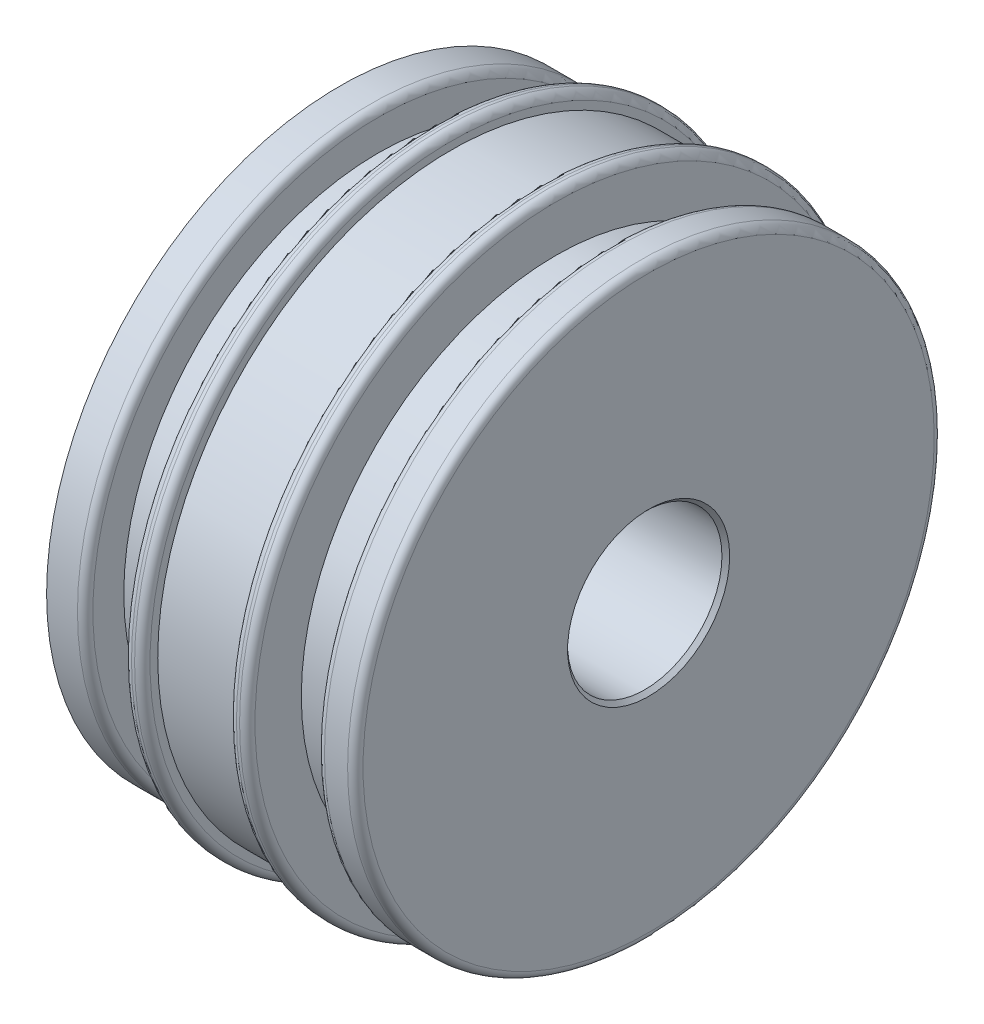
ISO-10303-21;
HEADER;
FILE_DESCRIPTION(('STEP AP214'),'2;1');
FILE_NAME('part.step','',(''),(''),'','','');
FILE_SCHEMA(('AUTOMOTIVE_DESIGN { 1 0 10303 214 1 1 1 1 }'));
ENDSEC;
DATA;
#1=APPLICATION_CONTEXT('core data for automotive mechanical design processes');
#2=APPLICATION_PROTOCOL_DEFINITION('international standard','automotive_design',2000,#1);
#3=PRODUCT_CONTEXT('',#1,'mechanical');
#4=PRODUCT('Part','Part','',(#3));
#5=PRODUCT_RELATED_PRODUCT_CATEGORY('part','',(#4));
#6=PRODUCT_DEFINITION_FORMATION('','',#4);
#7=PRODUCT_DEFINITION_CONTEXT('part definition',#1,'design');
#8=PRODUCT_DEFINITION('design','',#6,#7);
#9=PRODUCT_DEFINITION_SHAPE('','',#8);
#10=(LENGTH_UNIT() NAMED_UNIT(*) SI_UNIT(.MILLI.,.METRE.));
#11=(NAMED_UNIT(*) PLANE_ANGLE_UNIT() SI_UNIT($,.RADIAN.));
#12=(NAMED_UNIT(*) SI_UNIT($,.STERADIAN.) SOLID_ANGLE_UNIT());
#13=UNCERTAINTY_MEASURE_WITH_UNIT(LENGTH_MEASURE(1.E-05),#10,'distance_accuracy_value','');
#14=(GEOMETRIC_REPRESENTATION_CONTEXT(3) GLOBAL_UNCERTAINTY_ASSIGNED_CONTEXT((#13)) GLOBAL_UNIT_ASSIGNED_CONTEXT((#10,
#11,#12)) REPRESENTATION_CONTEXT('',''));
#15=CARTESIAN_POINT('',(0.,0.,0.));
#16=DIRECTION('',(0.,0.,1.));
#17=DIRECTION('',(1.,0.,0.));
#18=AXIS2_PLACEMENT_3D('',#15,#16,#17);
#19=CARTESIAN_POINT('',(-86.0525866178446,5.99999999999999,0.));
#20=DIRECTION('',(-1.,0.,0.));
#21=DIRECTION('',(0.,0.,1.));
#22=AXIS2_PLACEMENT_3D('',#19,#20,#21);
#23=PLANE('',#22);
#24=CARTESIAN_POINT('',(-86.0525866178446,0.,0.));
#25=DIRECTION('',(1.,0.,0.));
#26=DIRECTION('',(0.,0.,-1.));
#27=AXIS2_PLACEMENT_3D('',#24,#25,#26);
#28=CIRCLE('',#27,5.99999999999999);
#29=CARTESIAN_POINT('',(-86.0525866178446,0.,-5.99999999999999));
#30=VERTEX_POINT('',#29);
#31=EDGE_CURVE('E149',#30,#30,#28,.T.);
#32=ORIENTED_EDGE('',*,*,#31,.T.);
#33=EDGE_LOOP('',(#32));
#34=FACE_BOUND('',#33,.T.);
#35=CARTESIAN_POINT('',(-86.0525866178446,0.,0.));
#36=DIRECTION('',(1.,0.,0.));
#37=DIRECTION('',(0.,0.,-1.));
#38=AXIS2_PLACEMENT_3D('',#35,#36,#37);
#39=CIRCLE('',#38,7.95793834318191);
#40=CARTESIAN_POINT('',(-86.0525866178446,0.,-7.95793834318191));
#41=VERTEX_POINT('',#40);
#42=EDGE_CURVE('E185',#41,#41,#39,.T.);
#43=ORIENTED_EDGE('',*,*,#42,.F.);
#44=EDGE_LOOP('',(#43));
#45=FACE_BOUND('',#44,.T.);
#46=ADVANCED_FACE('F45',(#34,#45),#23,.T.);
#47=CARTESIAN_POINT('',(0.,0.,0.));
#48=DIRECTION('',(1.,0.,0.));
#49=DIRECTION('',(0.,0.,-1.));
#50=AXIS2_PLACEMENT_3D('',#47,#48,#49);
#51=CYLINDRICAL_SURFACE('',#50,5.99999999999999);
#52=CARTESIAN_POINT('',(-84.4583699245838,0.,0.));
#53=DIRECTION('',(1.,0.,0.));
#54=DIRECTION('',(0.,0.,-1.));
#55=AXIS2_PLACEMENT_3D('',#52,#53,#54);
#56=CIRCLE('',#55,5.99999999999999);
#57=CARTESIAN_POINT('',(-84.4583699245838,0.,-5.99999999999999));
#58=VERTEX_POINT('',#57);
#59=EDGE_CURVE('E129',#58,#58,#56,.T.);
#60=ORIENTED_EDGE('',*,*,#59,.T.);
#61=EDGE_LOOP('',(#60));
#62=FACE_BOUND('',#61,.T.);
#63=ORIENTED_EDGE('',*,*,#31,.F.);
#64=EDGE_LOOP('',(#63));
#65=FACE_BOUND('',#64,.T.);
#66=ADVANCED_FACE('F194',(#62,#65),#51,.F.);
#67=CARTESIAN_POINT('',(-84.2083699245837,5.99999999999999,0.));
#68=DIRECTION('',(1.,0.,0.));
#69=DIRECTION('',(0.,0.,-1.));
#70=AXIS2_PLACEMENT_3D('',#67,#68,#69);
#71=PLANE('',#70);
#72=CARTESIAN_POINT('',(-84.2083699245837,0.,0.));
#73=DIRECTION('',(1.,0.,0.));
#74=DIRECTION('',(0.,0.,-1.));
#75=AXIS2_PLACEMENT_3D('',#72,#73,#74);
#76=CIRCLE('',#75,6.25);
#77=CARTESIAN_POINT('',(-84.2083699245837,0.,-6.25));
#78=VERTEX_POINT('',#77);
#79=EDGE_CURVE('E121',#78,#78,#76,.F.);
#80=ORIENTED_EDGE('',*,*,#79,.T.);
#81=EDGE_LOOP('',(#80));
#82=FACE_BOUND('',#81,.T.);
#83=CARTESIAN_POINT('',(-84.2083699245837,0.,0.));
#84=DIRECTION('',(1.,0.,0.));
#85=DIRECTION('',(0.,0.,-1.));
#86=AXIS2_PLACEMENT_3D('',#83,#84,#85);
#87=CIRCLE('',#86,7.75);
#88=CARTESIAN_POINT('',(-84.2083699245837,0.,-7.75));
#89=VERTEX_POINT('',#88);
#90=EDGE_CURVE('E125',#89,#89,#87,.T.);
#91=ORIENTED_EDGE('',*,*,#90,.T.);
#92=EDGE_LOOP('',(#91));
#93=FACE_BOUND('',#92,.T.);
#94=ADVANCED_FACE('F201',(#82,#93),#71,.T.);
#95=CARTESIAN_POINT('',(0.,0.,0.));
#96=DIRECTION('',(1.,0.,0.));
#97=DIRECTION('',(0.,0.,-1.));
#98=AXIS2_PLACEMENT_3D('',#95,#96,#97);
#99=CYLINDRICAL_SURFACE('',#98,7.99999999999999);
#100=CARTESIAN_POINT('',(-81.6583699245838,0.,0.));
#101=DIRECTION('',(-1.,0.,0.));
#102=DIRECTION('',(0.,0.,1.));
#103=AXIS2_PLACEMENT_3D('',#100,#101,#102);
#104=CIRCLE('',#103,7.99999999999999);
#105=CARTESIAN_POINT('',(-81.6583699245838,0.,7.99999999999999));
#106=VERTEX_POINT('',#105);
#107=EDGE_CURVE('E141',#106,#106,#104,.F.);
#108=ORIENTED_EDGE('',*,*,#107,.T.);
#109=EDGE_LOOP('',(#108));
#110=FACE_BOUND('',#109,.T.);
#111=CARTESIAN_POINT('',(-83.9583699245838,0.,0.));
#112=DIRECTION('',(1.,0.,0.));
#113=DIRECTION('',(0.,0.,-1.));
#114=AXIS2_PLACEMENT_3D('',#111,#112,#113);
#115=CIRCLE('',#114,7.99999999999999);
#116=CARTESIAN_POINT('',(-83.9583699245838,0.,-7.99999999999999));
#117=VERTEX_POINT('',#116);
#118=EDGE_CURVE('E145',#117,#117,#115,.F.);
#119=ORIENTED_EDGE('',*,*,#118,.T.);
#120=EDGE_LOOP('',(#119));
#121=FACE_BOUND('',#120,.T.);
#122=ADVANCED_FACE('F326',(#110,#121),#99,.F.);
#123=CARTESIAN_POINT('',(-81.4083699245838,7.99999999999999,0.));
#124=DIRECTION('',(-1.,0.,0.));
#125=DIRECTION('',(0.,0.,1.));
#126=AXIS2_PLACEMENT_3D('',#123,#124,#125);
#127=PLANE('',#126);
#128=CARTESIAN_POINT('',(-81.4083699245838,0.,0.));
#129=DIRECTION('',(-1.,0.,0.));
#130=DIRECTION('',(0.,0.,1.));
#131=AXIS2_PLACEMENT_3D('',#128,#129,#130);
#132=CIRCLE('',#131,7.74999999999999);
#133=CARTESIAN_POINT('',(-81.4083699245838,0.,7.74999999999999));
#134=VERTEX_POINT('',#133);
#135=EDGE_CURVE('E133',#134,#134,#132,.T.);
#136=ORIENTED_EDGE('',*,*,#135,.T.);
#137=EDGE_LOOP('',(#136));
#138=FACE_BOUND('',#137,.T.);
#139=CARTESIAN_POINT('',(-81.4083699245838,0.,0.));
#140=DIRECTION('',(-1.,0.,0.));
#141=DIRECTION('',(0.,0.,1.));
#142=AXIS2_PLACEMENT_3D('',#139,#140,#141);
#143=CIRCLE('',#142,5.24999999999999);
#144=CARTESIAN_POINT('',(-81.4083699245838,0.,5.24999999999999));
#145=VERTEX_POINT('',#144);
#146=EDGE_CURVE('E137',#145,#145,#143,.F.);
#147=ORIENTED_EDGE('',*,*,#146,.T.);
#148=EDGE_LOOP('',(#147));
#149=FACE_BOUND('',#148,.T.);
#150=ADVANCED_FACE('F322',(#138,#149),#127,.T.);
#151=CARTESIAN_POINT('',(0.,0.,0.));
#152=DIRECTION('',(1.,0.,0.));
#153=DIRECTION('',(0.,0.,-1.));
#154=AXIS2_PLACEMENT_3D('',#151,#152,#153);
#155=CYLINDRICAL_SURFACE('',#154,4.99999999999999);
#156=CARTESIAN_POINT('',(-81.1583699245838,0.,0.));
#157=DIRECTION('',(-1.,0.,0.));
#158=DIRECTION('',(0.,0.,1.));
#159=AXIS2_PLACEMENT_3D('',#156,#157,#158);
#160=CIRCLE('',#159,4.99999999999999);
#161=CARTESIAN_POINT('',(-81.1583699245838,0.,4.99999999999999));
#162=VERTEX_POINT('',#161);
#163=EDGE_CURVE('E113',#162,#162,#160,.T.);
#164=ORIENTED_EDGE('',*,*,#163,.T.);
#165=EDGE_LOOP('',(#164));
#166=FACE_BOUND('',#165,.T.);
#167=CARTESIAN_POINT('',(-67.5993240848334,0.,0.));
#168=DIRECTION('',(1.,0.,0.));
#169=DIRECTION('',(0.,0.,-1.));
#170=AXIS2_PLACEMENT_3D('',#167,#168,#169);
#171=CIRCLE('',#170,4.99999999999999);
#172=CARTESIAN_POINT('',(-67.5993240848334,0.,-4.99999999999999));
#173=VERTEX_POINT('',#172);
#174=EDGE_CURVE('E117',#173,#173,#171,.T.);
#175=ORIENTED_EDGE('',*,*,#174,.T.);
#176=EDGE_LOOP('',(#175));
#177=FACE_BOUND('',#176,.T.);
#178=ADVANCED_FACE('F318',(#166,#177),#155,.F.);
#179=CARTESIAN_POINT('',(-67.3493240848334,4.99999999999999,0.));
#180=DIRECTION('',(1.,0.,0.));
#181=DIRECTION('',(0.,0.,-1.));
#182=AXIS2_PLACEMENT_3D('',#179,#180,#181);
#183=PLANE('',#182);
#184=CARTESIAN_POINT('',(-67.3493240848334,0.,0.));
#185=DIRECTION('',(1.,0.,0.));
#186=DIRECTION('',(0.,0.,-1.));
#187=AXIS2_PLACEMENT_3D('',#184,#185,#186);
#188=CIRCLE('',#187,18.5);
#189=CARTESIAN_POINT('',(-67.3493240848334,0.,-18.5));
#190=VERTEX_POINT('',#189);
#191=EDGE_CURVE('E105',#190,#190,#188,.T.);
#192=ORIENTED_EDGE('',*,*,#191,.T.);
#193=EDGE_LOOP('',(#192));
#194=FACE_BOUND('',#193,.T.);
#195=CARTESIAN_POINT('',(-67.3493240848334,0.,0.));
#196=DIRECTION('',(1.,0.,0.));
#197=DIRECTION('',(0.,0.,-1.));
#198=AXIS2_PLACEMENT_3D('',#195,#196,#197);
#199=CIRCLE('',#198,5.25);
#200=CARTESIAN_POINT('',(-67.3493240848334,0.,-5.25));
#201=VERTEX_POINT('',#200);
#202=EDGE_CURVE('E109',#201,#201,#199,.F.);
#203=ORIENTED_EDGE('',*,*,#202,.T.);
#204=EDGE_LOOP('',(#203));
#205=FACE_BOUND('',#204,.T.);
#206=ADVANCED_FACE('F314',(#194,#205),#183,.T.);
#207=CARTESIAN_POINT('',(0.,0.,0.));
#208=DIRECTION('',(1.,0.,0.));
#209=DIRECTION('',(0.,0.,-1.));
#210=AXIS2_PLACEMENT_3D('',#207,#208,#209);
#211=CYLINDRICAL_SURFACE('',#210,19.);
#212=CARTESIAN_POINT('',(-67.8493240848334,0.,0.));
#213=DIRECTION('',(1.,0.,0.));
#214=DIRECTION('',(0.,0.,-1.));
#215=AXIS2_PLACEMENT_3D('',#212,#213,#214);
#216=CIRCLE('',#215,19.);
#217=CARTESIAN_POINT('',(-67.8493240848334,0.,-19.));
#218=VERTEX_POINT('',#217);
#219=EDGE_CURVE('E97',#218,#218,#216,.F.);
#220=ORIENTED_EDGE('',*,*,#219,.T.);
#221=EDGE_LOOP('',(#220));
#222=FACE_BOUND('',#221,.T.);
#223=CARTESIAN_POINT('',(-69.3493240848334,0.,0.));
#224=DIRECTION('',(-1.,0.,0.));
#225=DIRECTION('',(0.,0.,1.));
#226=AXIS2_PLACEMENT_3D('',#223,#224,#225);
#227=CIRCLE('',#226,19.);
#228=CARTESIAN_POINT('',(-69.3493240848334,0.,19.));
#229=VERTEX_POINT('',#228);
#230=EDGE_CURVE('E101',#229,#229,#227,.F.);
#231=ORIENTED_EDGE('',*,*,#230,.T.);
#232=EDGE_LOOP('',(#231));
#233=FACE_BOUND('',#232,.T.);
#234=ADVANCED_FACE('F310',(#222,#233),#211,.T.);
#235=CARTESIAN_POINT('',(-69.8493240848334,19.,0.));
#236=DIRECTION('',(-1.,0.,0.));
#237=DIRECTION('',(0.,0.,1.));
#238=AXIS2_PLACEMENT_3D('',#235,#236,#237);
#239=PLANE('',#238);
#240=CARTESIAN_POINT('',(-69.8493240848334,0.,0.));
#241=DIRECTION('',(-1.,0.,0.));
#242=DIRECTION('',(0.,0.,1.));
#243=AXIS2_PLACEMENT_3D('',#240,#241,#242);
#244=CIRCLE('',#243,18.5);
#245=CARTESIAN_POINT('',(-69.8493240848334,0.,18.5));
#246=VERTEX_POINT('',#245);
#247=EDGE_CURVE('E93',#246,#246,#244,.T.);
#248=ORIENTED_EDGE('',*,*,#247,.T.);
#249=EDGE_LOOP('',(#248));
#250=FACE_BOUND('',#249,.T.);
#251=CARTESIAN_POINT('',(-69.8493240848334,0.,0.));
#252=DIRECTION('',(1.,0.,0.));
#253=DIRECTION('',(0.,0.,-1.));
#254=AXIS2_PLACEMENT_3D('',#251,#252,#253);
#255=CIRCLE('',#254,16.5);
#256=CARTESIAN_POINT('',(-69.8493240848334,0.,-16.5));
#257=VERTEX_POINT('',#256);
#258=EDGE_CURVE('E153',#257,#257,#255,.T.);
#259=ORIENTED_EDGE('',*,*,#258,.T.);
#260=EDGE_LOOP('',(#259));
#261=FACE_BOUND('',#260,.T.);
#262=ADVANCED_FACE('F306',(#250,#261),#239,.T.);
#263=CARTESIAN_POINT('',(0.,0.,0.));
#264=DIRECTION('',(1.,0.,0.));
#265=DIRECTION('',(0.,0.,-1.));
#266=AXIS2_PLACEMENT_3D('',#263,#264,#265);
#267=CYLINDRICAL_SURFACE('',#266,16.5);
#268=CARTESIAN_POINT('',(-73.3493240848334,0.,0.));
#269=DIRECTION('',(1.,0.,0.));
#270=DIRECTION('',(0.,0.,-1.));
#271=AXIS2_PLACEMENT_3D('',#268,#269,#270);
#272=CIRCLE('',#271,16.5);
#273=CARTESIAN_POINT('',(-73.3493240848334,0.,-16.5));
#274=VERTEX_POINT('',#273);
#275=EDGE_CURVE('E157',#274,#274,#272,.T.);
#276=ORIENTED_EDGE('',*,*,#275,.T.);
#277=EDGE_LOOP('',(#276));
#278=FACE_BOUND('',#277,.T.);
#279=ORIENTED_EDGE('',*,*,#258,.F.);
#280=EDGE_LOOP('',(#279));
#281=FACE_BOUND('',#280,.T.);
#282=ADVANCED_FACE('F303',(#278,#281),#267,.T.);
#283=CARTESIAN_POINT('',(-73.3493240848334,16.5,0.));
#284=DIRECTION('',(1.,0.,0.));
#285=DIRECTION('',(0.,0.,-1.));
#286=AXIS2_PLACEMENT_3D('',#283,#284,#285);
#287=PLANE('',#286);
#288=CARTESIAN_POINT('',(-73.3493240848334,0.,0.));
#289=DIRECTION('',(1.,0.,0.));
#290=DIRECTION('',(0.,0.,-1.));
#291=AXIS2_PLACEMENT_3D('',#288,#289,#290);
#292=CIRCLE('',#291,19.5);
#293=CARTESIAN_POINT('',(-73.3493240848334,0.,-19.5));
#294=VERTEX_POINT('',#293);
#295=EDGE_CURVE('E89',#294,#294,#292,.T.);
#296=ORIENTED_EDGE('',*,*,#295,.T.);
#297=EDGE_LOOP('',(#296));
#298=FACE_BOUND('',#297,.T.);
#299=ORIENTED_EDGE('',*,*,#275,.F.);
#300=EDGE_LOOP('',(#299));
#301=FACE_BOUND('',#300,.T.);
#302=ADVANCED_FACE('F299',(#298,#301),#287,.T.);
#303=CARTESIAN_POINT('',(0.,0.,0.));
#304=DIRECTION('',(1.,0.,0.));
#305=DIRECTION('',(0.,0.,-1.));
#306=AXIS2_PLACEMENT_3D('',#303,#304,#305);
#307=CYLINDRICAL_SURFACE('',#306,20.);
#308=CARTESIAN_POINT('',(-73.8493240848334,0.,0.));
#309=DIRECTION('',(1.,0.,0.));
#310=DIRECTION('',(0.,0.,-1.));
#311=AXIS2_PLACEMENT_3D('',#308,#309,#310);
#312=CIRCLE('',#311,20.);
#313=CARTESIAN_POINT('',(-73.8493240848334,0.,-20.));
#314=VERTEX_POINT('',#313);
#315=EDGE_CURVE('E81',#314,#314,#312,.F.);
#316=ORIENTED_EDGE('',*,*,#315,.T.);
#317=EDGE_LOOP('',(#316));
#318=FACE_BOUND('',#317,.T.);
#319=CARTESIAN_POINT('',(-74.0493240848334,0.,0.));
#320=DIRECTION('',(-1.,0.,0.));
#321=DIRECTION('',(0.,0.,1.));
#322=AXIS2_PLACEMENT_3D('',#319,#320,#321);
#323=CIRCLE('',#322,20.);
#324=CARTESIAN_POINT('',(-74.0493240848334,0.,20.));
#325=VERTEX_POINT('',#324);
#326=EDGE_CURVE('E85',#325,#325,#323,.F.);
#327=ORIENTED_EDGE('',*,*,#326,.T.);
#328=EDGE_LOOP('',(#327));
#329=FACE_BOUND('',#328,.T.);
#330=ADVANCED_FACE('F295',(#318,#329),#307,.T.);
#331=CARTESIAN_POINT('',(-74.5493240848334,20.,0.));
#332=DIRECTION('',(-1.,0.,0.));
#333=DIRECTION('',(0.,0.,1.));
#334=AXIS2_PLACEMENT_3D('',#331,#332,#333);
#335=PLANE('',#334);
#336=CARTESIAN_POINT('',(-74.5493240848334,0.,0.));
#337=DIRECTION('',(-1.,0.,0.));
#338=DIRECTION('',(0.,0.,1.));
#339=AXIS2_PLACEMENT_3D('',#336,#337,#338);
#340=CIRCLE('',#339,19.5);
#341=CARTESIAN_POINT('',(-74.5493240848334,0.,19.5));
#342=VERTEX_POINT('',#341);
#343=EDGE_CURVE('E77',#342,#342,#340,.T.);
#344=ORIENTED_EDGE('',*,*,#343,.T.);
#345=EDGE_LOOP('',(#344));
#346=FACE_BOUND('',#345,.T.);
#347=CARTESIAN_POINT('',(-74.5493240848334,0.,0.));
#348=DIRECTION('',(1.,0.,0.));
#349=DIRECTION('',(0.,0.,-1.));
#350=AXIS2_PLACEMENT_3D('',#347,#348,#349);
#351=CIRCLE('',#350,19.);
#352=CARTESIAN_POINT('',(-74.5493240848334,0.,-19.));
#353=VERTEX_POINT('',#352);
#354=EDGE_CURVE('E161',#353,#353,#351,.T.);
#355=ORIENTED_EDGE('',*,*,#354,.T.);
#356=EDGE_LOOP('',(#355));
#357=FACE_BOUND('',#356,.T.);
#358=ADVANCED_FACE('F291',(#346,#357),#335,.T.);
#359=CARTESIAN_POINT('',(0.,0.,0.));
#360=DIRECTION('',(1.,0.,0.));
#361=DIRECTION('',(0.,0.,-1.));
#362=AXIS2_PLACEMENT_3D('',#359,#360,#361);
#363=CYLINDRICAL_SURFACE('',#362,19.);
#364=CARTESIAN_POINT('',(-80.1493240848334,0.,0.));
#365=DIRECTION('',(1.,0.,0.));
#366=DIRECTION('',(0.,0.,-1.));
#367=AXIS2_PLACEMENT_3D('',#364,#365,#366);
#368=CIRCLE('',#367,19.);
#369=CARTESIAN_POINT('',(-80.1493240848334,0.,-19.));
#370=VERTEX_POINT('',#369);
#371=EDGE_CURVE('E165',#370,#370,#368,.T.);
#372=ORIENTED_EDGE('',*,*,#371,.T.);
#373=EDGE_LOOP('',(#372));
#374=FACE_BOUND('',#373,.T.);
#375=ORIENTED_EDGE('',*,*,#354,.F.);
#376=EDGE_LOOP('',(#375));
#377=FACE_BOUND('',#376,.T.);
#378=ADVANCED_FACE('F284',(#374,#377),#363,.T.);
#379=CARTESIAN_POINT('',(-80.1493240848334,19.,0.));
#380=DIRECTION('',(1.,0.,0.));
#381=DIRECTION('',(0.,0.,-1.));
#382=AXIS2_PLACEMENT_3D('',#379,#380,#381);
#383=PLANE('',#382);
#384=CARTESIAN_POINT('',(-80.1493240848334,0.,0.));
#385=DIRECTION('',(1.,0.,0.));
#386=DIRECTION('',(0.,0.,-1.));
#387=AXIS2_PLACEMENT_3D('',#384,#385,#386);
#388=CIRCLE('',#387,19.5);
#389=CARTESIAN_POINT('',(-80.1493240848334,0.,-19.5));
#390=VERTEX_POINT('',#389);
#391=EDGE_CURVE('E73',#390,#390,#388,.T.);
#392=ORIENTED_EDGE('',*,*,#391,.T.);
#393=EDGE_LOOP('',(#392));
#394=FACE_BOUND('',#393,.T.);
#395=ORIENTED_EDGE('',*,*,#371,.F.);
#396=EDGE_LOOP('',(#395));
#397=FACE_BOUND('',#396,.T.);
#398=ADVANCED_FACE('F274',(#394,#397),#383,.T.);
#399=CARTESIAN_POINT('',(0.,0.,0.));
#400=DIRECTION('',(1.,0.,0.));
#401=DIRECTION('',(0.,0.,-1.));
#402=AXIS2_PLACEMENT_3D('',#399,#400,#401);
#403=CYLINDRICAL_SURFACE('',#402,20.);
#404=CARTESIAN_POINT('',(-80.6493240848334,0.,0.));
#405=DIRECTION('',(1.,0.,0.));
#406=DIRECTION('',(0.,0.,-1.));
#407=AXIS2_PLACEMENT_3D('',#404,#405,#406);
#408=CIRCLE('',#407,20.);
#409=CARTESIAN_POINT('',(-80.6493240848334,0.,-20.));
#410=VERTEX_POINT('',#409);
#411=EDGE_CURVE('E63',#410,#410,#408,.F.);
#412=ORIENTED_EDGE('',*,*,#411,.T.);
#413=EDGE_LOOP('',(#412));
#414=FACE_BOUND('',#413,.T.);
#415=CARTESIAN_POINT('',(-80.8493240848334,0.,0.));
#416=DIRECTION('',(-1.,0.,0.));
#417=DIRECTION('',(0.,0.,1.));
#418=AXIS2_PLACEMENT_3D('',#415,#416,#417);
#419=CIRCLE('',#418,20.);
#420=CARTESIAN_POINT('',(-80.8493240848334,0.,20.));
#421=VERTEX_POINT('',#420);
#422=EDGE_CURVE('E69',#421,#421,#419,.F.);
#423=ORIENTED_EDGE('',*,*,#422,.T.);
#424=EDGE_LOOP('',(#423));
#425=FACE_BOUND('',#424,.T.);
#426=ADVANCED_FACE('F271',(#414,#425),#403,.T.);
#427=CARTESIAN_POINT('',(-81.3493240848334,20.,0.));
#428=DIRECTION('',(-1.,0.,0.));
#429=DIRECTION('',(0.,0.,1.));
#430=AXIS2_PLACEMENT_3D('',#427,#428,#429);
#431=PLANE('',#430);
#432=CARTESIAN_POINT('',(-81.3493240848334,0.,0.));
#433=DIRECTION('',(-1.,0.,0.));
#434=DIRECTION('',(0.,0.,1.));
#435=AXIS2_PLACEMENT_3D('',#432,#433,#434);
#436=CIRCLE('',#435,19.5);
#437=CARTESIAN_POINT('',(-81.3493240848334,0.,19.5));
#438=VERTEX_POINT('',#437);
#439=EDGE_CURVE('E58',#438,#438,#436,.T.);
#440=ORIENTED_EDGE('',*,*,#439,.T.);
#441=EDGE_LOOP('',(#440));
#442=FACE_BOUND('',#441,.T.);
#443=CARTESIAN_POINT('',(-81.3493240848334,0.,0.));
#444=DIRECTION('',(1.,0.,0.));
#445=DIRECTION('',(0.,0.,-1.));
#446=AXIS2_PLACEMENT_3D('',#443,#444,#445);
#447=CIRCLE('',#446,16.5);
#448=CARTESIAN_POINT('',(-81.3493240848334,0.,-16.5));
#449=VERTEX_POINT('',#448);
#450=EDGE_CURVE('E169',#449,#449,#447,.T.);
#451=ORIENTED_EDGE('',*,*,#450,.T.);
#452=EDGE_LOOP('',(#451));
#453=FACE_BOUND('',#452,.T.);
#454=ADVANCED_FACE('F273',(#442,#453),#431,.T.);
#455=CARTESIAN_POINT('',(0.,0.,0.));
#456=DIRECTION('',(1.,0.,0.));
#457=DIRECTION('',(0.,0.,-1.));
#458=AXIS2_PLACEMENT_3D('',#455,#456,#457);
#459=CYLINDRICAL_SURFACE('',#458,16.5);
#460=CARTESIAN_POINT('',(-84.8493240848334,0.,0.));
#461=DIRECTION('',(1.,0.,0.));
#462=DIRECTION('',(0.,0.,-1.));
#463=AXIS2_PLACEMENT_3D('',#460,#461,#462);
#464=CIRCLE('',#463,16.5);
#465=CARTESIAN_POINT('',(-84.8493240848334,0.,-16.5));
#466=VERTEX_POINT('',#465);
#467=EDGE_CURVE('E173',#466,#466,#464,.T.);
#468=ORIENTED_EDGE('',*,*,#467,.T.);
#469=EDGE_LOOP('',(#468));
#470=FACE_BOUND('',#469,.T.);
#471=ORIENTED_EDGE('',*,*,#450,.F.);
#472=EDGE_LOOP('',(#471));
#473=FACE_BOUND('',#472,.T.);
#474=ADVANCED_FACE('F281',(#470,#473),#459,.T.);
#475=CARTESIAN_POINT('',(-84.8493240848334,16.5,0.));
#476=DIRECTION('',(1.,0.,0.));
#477=DIRECTION('',(0.,0.,-1.));
#478=AXIS2_PLACEMENT_3D('',#475,#476,#477);
#479=PLANE('',#478);
#480=CARTESIAN_POINT('',(-84.8493240848334,0.,0.));
#481=DIRECTION('',(1.,0.,0.));
#482=DIRECTION('',(0.,0.,-1.));
#483=AXIS2_PLACEMENT_3D('',#480,#481,#482);
#484=CIRCLE('',#483,18.5);
#485=CARTESIAN_POINT('',(-84.8493240848334,0.,-18.5));
#486=VERTEX_POINT('',#485);
#487=EDGE_CURVE('E53',#486,#486,#484,.T.);
#488=ORIENTED_EDGE('',*,*,#487,.T.);
#489=EDGE_LOOP('',(#488));
#490=FACE_BOUND('',#489,.T.);
#491=ORIENTED_EDGE('',*,*,#467,.F.);
#492=EDGE_LOOP('',(#491));
#493=FACE_BOUND('',#492,.T.);
#494=ADVANCED_FACE('F448',(#490,#493),#479,.T.);
#495=CARTESIAN_POINT('',(0.,0.,0.));
#496=DIRECTION('',(1.,0.,0.));
#497=DIRECTION('',(0.,0.,-1.));
#498=AXIS2_PLACEMENT_3D('',#495,#496,#497);
#499=CYLINDRICAL_SURFACE('',#498,19.);
#500=CARTESIAN_POINT('',(-85.3493240848334,0.,0.));
#501=DIRECTION('',(1.,0.,0.));
#502=DIRECTION('',(0.,0.,-1.));
#503=AXIS2_PLACEMENT_3D('',#500,#501,#502);
#504=CIRCLE('',#503,19.);
#505=CARTESIAN_POINT('',(-85.3493240848334,0.,-19.));
#506=VERTEX_POINT('',#505);
#507=EDGE_CURVE('E10',#506,#506,#504,.F.);
#508=ORIENTED_EDGE('',*,*,#507,.T.);
#509=EDGE_LOOP('',(#508));
#510=FACE_BOUND('',#509,.T.);
#511=CARTESIAN_POINT('',(-87.3493240848334,0.,0.));
#512=DIRECTION('',(1.,0.,0.));
#513=DIRECTION('',(0.,0.,-1.));
#514=AXIS2_PLACEMENT_3D('',#511,#512,#513);
#515=CIRCLE('',#514,19.);
#516=CARTESIAN_POINT('',(-87.3493240848334,0.,-19.));
#517=VERTEX_POINT('',#516);
#518=EDGE_CURVE('E177',#517,#517,#515,.T.);
#519=ORIENTED_EDGE('',*,*,#518,.T.);
#520=EDGE_LOOP('',(#519));
#521=FACE_BOUND('',#520,.T.);
#522=ADVANCED_FACE('F457',(#510,#521),#499,.T.);
#523=CARTESIAN_POINT('',(-87.3493240848334,19.,0.));
#524=DIRECTION('',(-1.,0.,0.));
#525=DIRECTION('',(0.,0.,1.));
#526=AXIS2_PLACEMENT_3D('',#523,#524,#525);
#527=PLANE('',#526);
#528=CARTESIAN_POINT('',(-87.3493240848334,0.,0.));
#529=DIRECTION('',(1.,0.,0.));
#530=DIRECTION('',(0.,0.,-1.));
#531=AXIS2_PLACEMENT_3D('',#528,#529,#530);
#532=CIRCLE('',#531,7.95793834318191);
#533=CARTESIAN_POINT('',(-87.3493240848334,0.,-7.95793834318191));
#534=VERTEX_POINT('',#533);
#535=EDGE_CURVE('E181',#534,#534,#532,.T.);
#536=ORIENTED_EDGE('',*,*,#535,.T.);
#537=EDGE_LOOP('',(#536));
#538=FACE_BOUND('',#537,.T.);
#539=ORIENTED_EDGE('',*,*,#518,.F.);
#540=EDGE_LOOP('',(#539));
#541=FACE_BOUND('',#540,.T.);
#542=ADVANCED_FACE('F466',(#538,#541),#527,.T.);
#543=CARTESIAN_POINT('',(0.,0.,0.));
#544=DIRECTION('',(1.,0.,0.));
#545=DIRECTION('',(0.,0.,-1.));
#546=AXIS2_PLACEMENT_3D('',#543,#544,#545);
#547=CYLINDRICAL_SURFACE('',#546,7.95793834318191);
#548=ORIENTED_EDGE('',*,*,#42,.T.);
#549=EDGE_LOOP('',(#548));
#550=FACE_BOUND('',#549,.T.);
#551=ORIENTED_EDGE('',*,*,#535,.F.);
#552=EDGE_LOOP('',(#551));
#553=FACE_BOUND('',#552,.T.);
#554=ADVANCED_FACE('F190',(#550,#553),#547,.F.);
#555=CARTESIAN_POINT('',(-81.6583699245838,0.,0.));
#556=DIRECTION('',(-1.,0.,0.));
#557=DIRECTION('',(0.,0.,1.));
#558=AXIS2_PLACEMENT_3D('',#555,#556,#557);
#559=CONICAL_SURFACE('',#558,7.99999999999999,0.785398163397441);
#560=ORIENTED_EDGE('',*,*,#135,.F.);
#561=EDGE_LOOP('',(#560));
#562=FACE_BOUND('',#561,.T.);
#563=ORIENTED_EDGE('',*,*,#107,.F.);
#564=EDGE_LOOP('',(#563));
#565=FACE_BOUND('',#564,.T.);
#566=ADVANCED_FACE('F207',(#562,#565),#559,.F.);
#567=CARTESIAN_POINT('',(-84.4583699245838,0.,0.));
#568=DIRECTION('',(1.,0.,0.));
#569=DIRECTION('',(0.,0.,-1.));
#570=AXIS2_PLACEMENT_3D('',#567,#568,#569);
#571=CONICAL_SURFACE('',#570,5.99999999999999,0.785398163397438);
#572=ORIENTED_EDGE('',*,*,#79,.F.);
#573=EDGE_LOOP('',(#572));
#574=FACE_BOUND('',#573,.T.);
#575=ORIENTED_EDGE('',*,*,#59,.F.);
#576=EDGE_LOOP('',(#575));
#577=FACE_BOUND('',#576,.T.);
#578=ADVANCED_FACE('F213',(#574,#577),#571,.F.);
#579=CARTESIAN_POINT('',(-84.2083699245837,0.,0.));
#580=DIRECTION('',(1.,0.,0.));
#581=DIRECTION('',(0.,0.,-1.));
#582=AXIS2_PLACEMENT_3D('',#579,#580,#581);
#583=CONICAL_SURFACE('',#582,7.75,0.785398163397455);
#584=ORIENTED_EDGE('',*,*,#118,.F.);
#585=EDGE_LOOP('',(#584));
#586=FACE_BOUND('',#585,.T.);
#587=ORIENTED_EDGE('',*,*,#90,.F.);
#588=EDGE_LOOP('',(#587));
#589=FACE_BOUND('',#588,.T.);
#590=ADVANCED_FACE('F220',(#586,#589),#583,.F.);
#591=CARTESIAN_POINT('',(-81.4083699245838,0.,0.));
#592=DIRECTION('',(-1.,0.,0.));
#593=DIRECTION('',(0.,0.,1.));
#594=AXIS2_PLACEMENT_3D('',#591,#592,#593);
#595=CONICAL_SURFACE('',#594,5.24999999999999,0.785398163397448);
#596=ORIENTED_EDGE('',*,*,#163,.F.);
#597=EDGE_LOOP('',(#596));
#598=FACE_BOUND('',#597,.T.);
#599=ORIENTED_EDGE('',*,*,#146,.F.);
#600=EDGE_LOOP('',(#599));
#601=FACE_BOUND('',#600,.T.);
#602=ADVANCED_FACE('F227',(#598,#601),#595,.F.);
#603=CARTESIAN_POINT('',(-67.5993240848334,0.,0.));
#604=DIRECTION('',(1.,0.,0.));
#605=DIRECTION('',(0.,0.,-1.));
#606=AXIS2_PLACEMENT_3D('',#603,#604,#605);
#607=CONICAL_SURFACE('',#606,4.99999999999999,0.785398163397462);
#608=ORIENTED_EDGE('',*,*,#202,.F.);
#609=EDGE_LOOP('',(#608));
#610=FACE_BOUND('',#609,.T.);
#611=ORIENTED_EDGE('',*,*,#174,.F.);
#612=EDGE_LOOP('',(#611));
#613=FACE_BOUND('',#612,.T.);
#614=ADVANCED_FACE('F234',(#610,#613),#607,.F.);
#615=CARTESIAN_POINT('',(-67.8493240848334,0.,0.));
#616=DIRECTION('',(1.,0.,0.));
#617=DIRECTION('',(0.,0.,-1.));
#618=AXIS2_PLACEMENT_3D('',#615,#616,#617);
#619=TOROIDAL_SURFACE('',#618,18.5,0.5);
#620=ORIENTED_EDGE('',*,*,#219,.F.);
#621=EDGE_LOOP('',(#620));
#622=FACE_BOUND('',#621,.T.);
#623=ORIENTED_EDGE('',*,*,#191,.F.);
#624=EDGE_LOOP('',(#623));
#625=FACE_BOUND('',#624,.T.);
#626=ADVANCED_FACE('F240',(#622,#625),#619,.T.);
#627=CARTESIAN_POINT('',(-69.3493240848334,0.,0.));
#628=DIRECTION('',(-1.,0.,0.));
#629=DIRECTION('',(0.,0.,1.));
#630=AXIS2_PLACEMENT_3D('',#627,#628,#629);
#631=TOROIDAL_SURFACE('',#630,18.5,0.5);
#632=ORIENTED_EDGE('',*,*,#247,.F.);
#633=EDGE_LOOP('',(#632));
#634=FACE_BOUND('',#633,.T.);
#635=ORIENTED_EDGE('',*,*,#230,.F.);
#636=EDGE_LOOP('',(#635));
#637=FACE_BOUND('',#636,.T.);
#638=ADVANCED_FACE('F244',(#634,#637),#631,.T.);
#639=CARTESIAN_POINT('',(-73.8493240848334,0.,0.));
#640=DIRECTION('',(1.,0.,0.));
#641=DIRECTION('',(0.,0.,-1.));
#642=AXIS2_PLACEMENT_3D('',#639,#640,#641);
#643=TOROIDAL_SURFACE('',#642,19.5,0.5);
#644=ORIENTED_EDGE('',*,*,#315,.F.);
#645=EDGE_LOOP('',(#644));
#646=FACE_BOUND('',#645,.T.);
#647=ORIENTED_EDGE('',*,*,#295,.F.);
#648=EDGE_LOOP('',(#647));
#649=FACE_BOUND('',#648,.T.);
#650=ADVANCED_FACE('F248',(#646,#649),#643,.T.);
#651=CARTESIAN_POINT('',(-74.0493240848334,0.,0.));
#652=DIRECTION('',(-1.,0.,0.));
#653=DIRECTION('',(0.,0.,1.));
#654=AXIS2_PLACEMENT_3D('',#651,#652,#653);
#655=TOROIDAL_SURFACE('',#654,19.5,0.5);
#656=ORIENTED_EDGE('',*,*,#343,.F.);
#657=EDGE_LOOP('',(#656));
#658=FACE_BOUND('',#657,.T.);
#659=ORIENTED_EDGE('',*,*,#326,.F.);
#660=EDGE_LOOP('',(#659));
#661=FACE_BOUND('',#660,.T.);
#662=ADVANCED_FACE('F252',(#658,#661),#655,.T.);
#663=CARTESIAN_POINT('',(-80.6493240848334,0.,0.));
#664=DIRECTION('',(1.,0.,0.));
#665=DIRECTION('',(0.,0.,-1.));
#666=AXIS2_PLACEMENT_3D('',#663,#664,#665);
#667=TOROIDAL_SURFACE('',#666,19.5,0.5);
#668=ORIENTED_EDGE('',*,*,#411,.F.);
#669=EDGE_LOOP('',(#668));
#670=FACE_BOUND('',#669,.T.);
#671=ORIENTED_EDGE('',*,*,#391,.F.);
#672=EDGE_LOOP('',(#671));
#673=FACE_BOUND('',#672,.T.);
#674=ADVANCED_FACE('F256',(#670,#673),#667,.T.);
#675=CARTESIAN_POINT('',(-80.8493240848334,0.,0.));
#676=DIRECTION('',(-1.,0.,0.));
#677=DIRECTION('',(0.,0.,1.));
#678=AXIS2_PLACEMENT_3D('',#675,#676,#677);
#679=TOROIDAL_SURFACE('',#678,19.5,0.5);
#680=ORIENTED_EDGE('',*,*,#439,.F.);
#681=EDGE_LOOP('',(#680));
#682=FACE_BOUND('',#681,.T.);
#683=ORIENTED_EDGE('',*,*,#422,.F.);
#684=EDGE_LOOP('',(#683));
#685=FACE_BOUND('',#684,.T.);
#686=ADVANCED_FACE('F259',(#682,#685),#679,.T.);
#687=CARTESIAN_POINT('',(-85.3493240848334,0.,0.));
#688=DIRECTION('',(1.,0.,0.));
#689=DIRECTION('',(0.,0.,-1.));
#690=AXIS2_PLACEMENT_3D('',#687,#688,#689);
#691=TOROIDAL_SURFACE('',#690,18.5,0.5);
#692=ORIENTED_EDGE('',*,*,#507,.F.);
#693=EDGE_LOOP('',(#692));
#694=FACE_BOUND('',#693,.T.);
#695=ORIENTED_EDGE('',*,*,#487,.F.);
#696=EDGE_LOOP('',(#695));
#697=FACE_BOUND('',#696,.T.);
#698=ADVANCED_FACE('F47',(#694,#697),#691,.T.);
#699=CLOSED_SHELL('',(#46,#66,#94,#122,#150,#178,#206,#234,#262,#282,#302,#330,#358,#378,#398,
#426,#454,#474,#494,#522,#542,#554,#566,#578,#590,#602,#614,#626,#638,#650,#662,#674,#686,#698));
#700=MANIFOLD_SOLID_BREP('B2',#699);
#701=ADVANCED_BREP_SHAPE_REPRESENTATION('',(#18,#700),#14);
#702=SHAPE_DEFINITION_REPRESENTATION(#9,#701);
ENDSEC;
END-ISO-10303-21;
